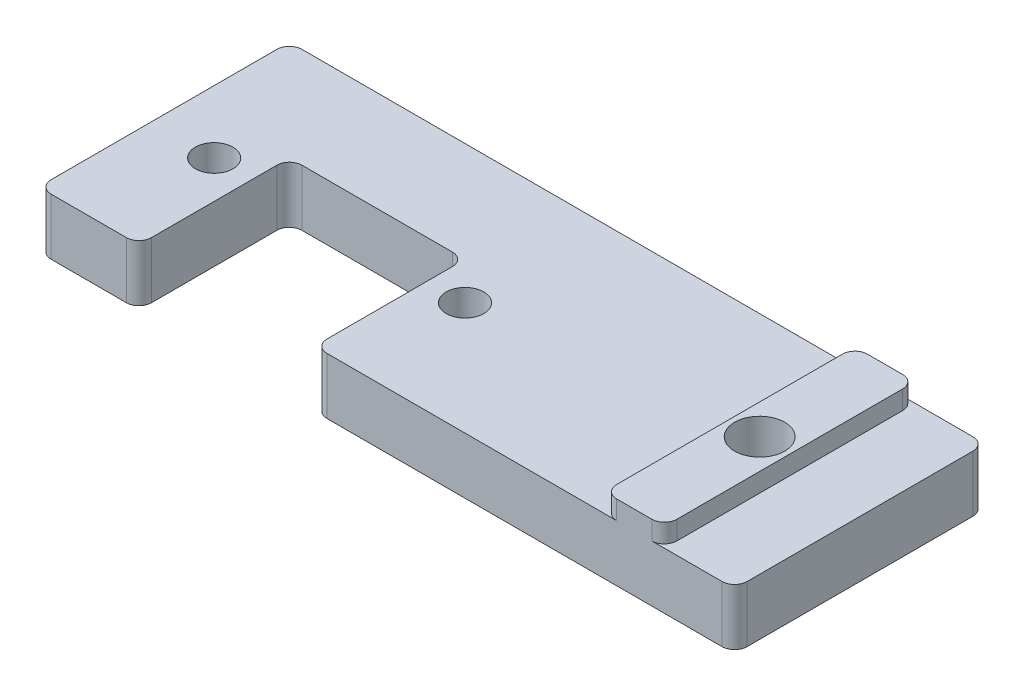
ISO-10303-21;
HEADER;
FILE_DESCRIPTION(('STEP AP214'),'2;1');
FILE_NAME('part.step','',(''),(''),'','','');
FILE_SCHEMA(('AUTOMOTIVE_DESIGN { 1 0 10303 214 1 1 1 1 }'));
ENDSEC;
DATA;
#1=APPLICATION_CONTEXT('core data for automotive mechanical design processes');
#2=APPLICATION_PROTOCOL_DEFINITION('international standard','automotive_design',2000,#1);
#3=PRODUCT_CONTEXT('',#1,'mechanical');
#4=PRODUCT('Part','Part','',(#3));
#5=PRODUCT_RELATED_PRODUCT_CATEGORY('part','',(#4));
#6=PRODUCT_DEFINITION_FORMATION('','',#4);
#7=PRODUCT_DEFINITION_CONTEXT('part definition',#1,'design');
#8=PRODUCT_DEFINITION('design','',#6,#7);
#9=PRODUCT_DEFINITION_SHAPE('','',#8);
#10=(LENGTH_UNIT() NAMED_UNIT(*) SI_UNIT(.MILLI.,.METRE.));
#11=(NAMED_UNIT(*) PLANE_ANGLE_UNIT() SI_UNIT($,.RADIAN.));
#12=(NAMED_UNIT(*) SI_UNIT($,.STERADIAN.) SOLID_ANGLE_UNIT());
#13=UNCERTAINTY_MEASURE_WITH_UNIT(LENGTH_MEASURE(1.E-05),#10,'distance_accuracy_value','');
#14=(GEOMETRIC_REPRESENTATION_CONTEXT(3) GLOBAL_UNCERTAINTY_ASSIGNED_CONTEXT((#13)) GLOBAL_UNIT_ASSIGNED_CONTEXT((#10,
#11,#12)) REPRESENTATION_CONTEXT('',''));
#15=CARTESIAN_POINT('',(0.,0.,0.));
#16=DIRECTION('',(0.,0.,1.));
#17=DIRECTION('',(1.,0.,0.));
#18=AXIS2_PLACEMENT_3D('',#15,#16,#17);
#19=CARTESIAN_POINT('',(0.,0.,0.));
#20=DIRECTION('',(0.,1.,0.));
#21=DIRECTION('',(0.,0.,1.));
#22=AXIS2_PLACEMENT_3D('',#19,#20,#21);
#23=PLANE('',#22);
#24=CARTESIAN_POINT('',(-10.,0.,0.));
#25=DIRECTION('',(0.,-1.,0.));
#26=DIRECTION('',(0.,0.,1.));
#27=AXIS2_PLACEMENT_3D('',#24,#25,#26);
#28=CIRCLE('',#27,1.5);
#29=CARTESIAN_POINT('',(-10.,0.,1.5));
#30=VERTEX_POINT('',#29);
#31=EDGE_CURVE('E337',#30,#30,#28,.T.);
#32=ORIENTED_EDGE('',*,*,#31,.F.);
#33=EDGE_LOOP('',(#32));
#34=FACE_BOUND('',#33,.T.);
#35=CARTESIAN_POINT('',(10.,0.,0.));
#36=DIRECTION('',(0.,1.,0.));
#37=DIRECTION('',(0.,0.,1.));
#38=AXIS2_PLACEMENT_3D('',#35,#36,#37);
#39=CIRCLE('',#38,1.5);
#40=CARTESIAN_POINT('',(10.,0.,1.5));
#41=VERTEX_POINT('',#40);
#42=EDGE_CURVE('E257',#41,#41,#39,.T.);
#43=ORIENTED_EDGE('',*,*,#42,.T.);
#44=EDGE_LOOP('',(#43));
#45=FACE_BOUND('',#44,.T.);
#46=DIRECTION('',(-1.,0.,0.));
#47=VECTOR('',#46,1.);
#48=CARTESIAN_POINT('',(15.,0.,-11.));
#49=LINE('',#48,#47);
#50=CARTESIAN_POINT('',(39.5,0.,-11.));
#51=VERTEX_POINT('',#50);
#52=CARTESIAN_POINT('',(-14.,0.,-11.));
#53=VERTEX_POINT('',#52);
#54=EDGE_CURVE('E196',#51,#53,#49,.T.);
#55=ORIENTED_EDGE('',*,*,#54,.F.);
#56=CARTESIAN_POINT('',(39.5,0.,-10.));
#57=DIRECTION('',(0.,1.,0.));
#58=DIRECTION('',(0.,0.,1.));
#59=AXIS2_PLACEMENT_3D('',#56,#57,#58);
#60=CIRCLE('',#59,1.);
#61=CARTESIAN_POINT('',(40.5,0.,-10.));
#62=VERTEX_POINT('',#61);
#63=EDGE_CURVE('E498',#51,#62,#60,.F.);
#64=ORIENTED_EDGE('',*,*,#63,.T.);
#65=DIRECTION('',(0.,0.,1.));
#66=VECTOR('',#65,1.);
#67=CARTESIAN_POINT('',(40.5,0.,-11.));
#68=LINE('',#67,#66);
#69=CARTESIAN_POINT('',(40.5,0.,8.));
#70=VERTEX_POINT('',#69);
#71=EDGE_CURVE('E334',#62,#70,#68,.T.);
#72=ORIENTED_EDGE('',*,*,#71,.T.);
#73=CARTESIAN_POINT('',(39.5,0.,8.));
#74=DIRECTION('',(0.,1.,0.));
#75=DIRECTION('',(0.,0.,1.));
#76=AXIS2_PLACEMENT_3D('',#73,#74,#75);
#77=CIRCLE('',#76,1.);
#78=CARTESIAN_POINT('',(39.5,0.,9.));
#79=VERTEX_POINT('',#78);
#80=EDGE_CURVE('E502',#70,#79,#77,.F.);
#81=ORIENTED_EDGE('',*,*,#80,.T.);
#82=DIRECTION('',(1.,0.,0.));
#83=VECTOR('',#82,1.);
#84=CARTESIAN_POINT('',(7.,0.,9.));
#85=LINE('',#84,#83);
#86=CARTESIAN_POINT('',(8.,0.,9.));
#87=VERTEX_POINT('',#86);
#88=EDGE_CURVE('E207',#87,#79,#85,.T.);
#89=ORIENTED_EDGE('',*,*,#88,.F.);
#90=CARTESIAN_POINT('',(8.,0.,8.));
#91=DIRECTION('',(0.,1.,0.));
#92=DIRECTION('',(0.,0.,1.));
#93=AXIS2_PLACEMENT_3D('',#90,#91,#92);
#94=CIRCLE('',#93,1.);
#95=CARTESIAN_POINT('',(7.,0.,8.));
#96=VERTEX_POINT('',#95);
#97=EDGE_CURVE('E296',#87,#96,#94,.F.);
#98=ORIENTED_EDGE('',*,*,#97,.T.);
#99=DIRECTION('',(0.,0.,1.));
#100=VECTOR('',#99,1.);
#101=CARTESIAN_POINT('',(7.,0.,9.));
#102=LINE('',#101,#100);
#103=CARTESIAN_POINT('',(7.,0.,-2.));
#104=VERTEX_POINT('',#103);
#105=EDGE_CURVE('E261',#104,#96,#102,.T.);
#106=ORIENTED_EDGE('',*,*,#105,.F.);
#107=CARTESIAN_POINT('',(6.,0.,-2.));
#108=DIRECTION('',(0.,1.,0.));
#109=DIRECTION('',(0.,0.,1.));
#110=AXIS2_PLACEMENT_3D('',#107,#108,#109);
#111=CIRCLE('',#110,1.);
#112=CARTESIAN_POINT('',(6.,0.,-3.));
#113=VERTEX_POINT('',#112);
#114=EDGE_CURVE('E282',#104,#113,#111,.T.);
#115=ORIENTED_EDGE('',*,*,#114,.T.);
#116=DIRECTION('',(1.,0.,0.));
#117=VECTOR('',#116,1.);
#118=CARTESIAN_POINT('',(7.,0.,-3.));
#119=LINE('',#118,#117);
#120=CARTESIAN_POINT('',(-6.,0.,-3.));
#121=VERTEX_POINT('',#120);
#122=EDGE_CURVE('E206',#121,#113,#119,.T.);
#123=ORIENTED_EDGE('',*,*,#122,.F.);
#124=CARTESIAN_POINT('',(-6.,0.,-2.));
#125=DIRECTION('',(0.,-1.,0.));
#126=DIRECTION('',(0.,0.,1.));
#127=AXIS2_PLACEMENT_3D('',#124,#125,#126);
#128=CIRCLE('',#127,1.);
#129=CARTESIAN_POINT('',(-7.,0.,-2.));
#130=VERTEX_POINT('',#129);
#131=EDGE_CURVE('E251',#130,#121,#128,.T.);
#132=ORIENTED_EDGE('',*,*,#131,.F.);
#133=DIRECTION('',(0.,0.,1.));
#134=VECTOR('',#133,1.);
#135=CARTESIAN_POINT('',(-7.,0.,9.));
#136=LINE('',#135,#134);
#137=CARTESIAN_POINT('',(-7.,0.,8.));
#138=VERTEX_POINT('',#137);
#139=EDGE_CURVE('E344',#130,#138,#136,.T.);
#140=ORIENTED_EDGE('',*,*,#139,.T.);
#141=CARTESIAN_POINT('',(-8.,0.,8.));
#142=DIRECTION('',(0.,-1.,0.));
#143=DIRECTION('',(0.,0.,1.));
#144=AXIS2_PLACEMENT_3D('',#141,#142,#143);
#145=CIRCLE('',#144,1.);
#146=CARTESIAN_POINT('',(-8.,0.,9.));
#147=VERTEX_POINT('',#146);
#148=EDGE_CURVE('E216',#147,#138,#145,.F.);
#149=ORIENTED_EDGE('',*,*,#148,.F.);
#150=DIRECTION('',(-1.,0.,0.));
#151=VECTOR('',#150,1.);
#152=CARTESIAN_POINT('',(-7.,0.,9.));
#153=LINE('',#152,#151);
#154=CARTESIAN_POINT('',(-14.,0.,9.));
#155=VERTEX_POINT('',#154);
#156=EDGE_CURVE('E357',#147,#155,#153,.T.);
#157=ORIENTED_EDGE('',*,*,#156,.T.);
#158=CARTESIAN_POINT('',(-14.,0.,8.));
#159=DIRECTION('',(0.,-1.,0.));
#160=DIRECTION('',(0.,0.,1.));
#161=AXIS2_PLACEMENT_3D('',#158,#159,#160);
#162=CIRCLE('',#161,1.);
#163=CARTESIAN_POINT('',(-15.,0.,8.));
#164=VERTEX_POINT('',#163);
#165=EDGE_CURVE('E224',#164,#155,#162,.F.);
#166=ORIENTED_EDGE('',*,*,#165,.F.);
#167=DIRECTION('',(0.,0.,-1.));
#168=VECTOR('',#167,1.);
#169=CARTESIAN_POINT('',(-15.,0.,9.));
#170=LINE('',#169,#168);
#171=CARTESIAN_POINT('',(-15.,0.,-10.));
#172=VERTEX_POINT('',#171);
#173=EDGE_CURVE('E222',#164,#172,#170,.T.);
#174=ORIENTED_EDGE('',*,*,#173,.T.);
#175=CARTESIAN_POINT('',(-14.,0.,-10.));
#176=DIRECTION('',(0.,-1.,0.));
#177=DIRECTION('',(0.,0.,1.));
#178=AXIS2_PLACEMENT_3D('',#175,#176,#177);
#179=CIRCLE('',#178,1.);
#180=EDGE_CURVE('E212',#53,#172,#179,.F.);
#181=ORIENTED_EDGE('',*,*,#180,.F.);
#182=EDGE_LOOP('',(#55,#64,#72,#81,#89,#98,#106,#115,#123,#132,#140,#149,#157,#166,#174,#181));
#183=FACE_BOUND('',#182,.T.);
#184=CARTESIAN_POINT('',(32.5,0.,-1.));
#185=DIRECTION('',(0.,-1.,0.));
#186=DIRECTION('',(0.,0.,-1.));
#187=AXIS2_PLACEMENT_3D('',#184,#185,#186);
#188=CIRCLE('',#187,2.);
#189=CARTESIAN_POINT('',(32.5,0.,-3.));
#190=VERTEX_POINT('',#189);
#191=EDGE_CURVE('E444',#190,#190,#188,.T.);
#192=ORIENTED_EDGE('',*,*,#191,.F.);
#193=EDGE_LOOP('',(#192));
#194=FACE_BOUND('',#193,.T.);
#195=ADVANCED_FACE('F33',(#34,#45,#183,#194),#23,.F.);
#196=CARTESIAN_POINT('',(0.,4.5,0.));
#197=DIRECTION('',(0.,1.,0.));
#198=DIRECTION('',(0.,0.,1.));
#199=AXIS2_PLACEMENT_3D('',#196,#197,#198);
#200=PLANE('',#199);
#201=CARTESIAN_POINT('',(-10.,4.5,0.));
#202=DIRECTION('',(0.,-1.,0.));
#203=DIRECTION('',(0.,0.,1.));
#204=AXIS2_PLACEMENT_3D('',#201,#202,#203);
#205=CIRCLE('',#204,1.5);
#206=CARTESIAN_POINT('',(-10.,4.5,1.5));
#207=VERTEX_POINT('',#206);
#208=EDGE_CURVE('E341',#207,#207,#205,.T.);
#209=ORIENTED_EDGE('',*,*,#208,.T.);
#210=EDGE_LOOP('',(#209));
#211=FACE_BOUND('',#210,.T.);
#212=CARTESIAN_POINT('',(10.,4.5,0.));
#213=DIRECTION('',(0.,1.,0.));
#214=DIRECTION('',(0.,0.,1.));
#215=AXIS2_PLACEMENT_3D('',#212,#213,#214);
#216=CIRCLE('',#215,1.5);
#217=CARTESIAN_POINT('',(10.,4.5,1.5));
#218=VERTEX_POINT('',#217);
#219=EDGE_CURVE('E258',#218,#218,#216,.T.);
#220=ORIENTED_EDGE('',*,*,#219,.F.);
#221=EDGE_LOOP('',(#220));
#222=FACE_BOUND('',#221,.T.);
#223=DIRECTION('',(1.,0.,0.));
#224=VECTOR('',#223,1.);
#225=CARTESIAN_POINT('',(7.,4.5,9.));
#226=LINE('',#225,#224);
#227=CARTESIAN_POINT('',(8.,4.5,9.));
#228=VERTEX_POINT('',#227);
#229=CARTESIAN_POINT('',(31.1,4.5,9.));
#230=VERTEX_POINT('',#229);
#231=EDGE_CURVE('E276',#228,#230,#226,.T.);
#232=ORIENTED_EDGE('',*,*,#231,.T.);
#233=CARTESIAN_POINT('',(31.1,4.5,8.));
#234=DIRECTION('',(0.,1.,0.));
#235=DIRECTION('',(0.,0.,1.));
#236=AXIS2_PLACEMENT_3D('',#233,#234,#235);
#237=CIRCLE('',#236,1.);
#238=CARTESIAN_POINT('',(30.1,4.5,8.));
#239=VERTEX_POINT('',#238);
#240=EDGE_CURVE('E501',#230,#239,#237,.F.);
#241=ORIENTED_EDGE('',*,*,#240,.T.);
#242=DIRECTION('',(0.,0.,-1.));
#243=VECTOR('',#242,1.);
#244=CARTESIAN_POINT('',(30.1,4.5,9.));
#245=LINE('',#244,#243);
#246=CARTESIAN_POINT('',(30.1,4.5,-10.));
#247=VERTEX_POINT('',#246);
#248=EDGE_CURVE('E327',#239,#247,#245,.T.);
#249=ORIENTED_EDGE('',*,*,#248,.T.);
#250=CARTESIAN_POINT('',(31.1,4.5,-10.));
#251=DIRECTION('',(0.,1.,0.));
#252=DIRECTION('',(0.,0.,1.));
#253=AXIS2_PLACEMENT_3D('',#250,#251,#252);
#254=CIRCLE('',#253,1.);
#255=CARTESIAN_POINT('',(31.1,4.5,-11.));
#256=VERTEX_POINT('',#255);
#257=EDGE_CURVE('E383',#247,#256,#254,.F.);
#258=ORIENTED_EDGE('',*,*,#257,.T.);
#259=DIRECTION('',(-1.,0.,0.));
#260=VECTOR('',#259,1.);
#261=CARTESIAN_POINT('',(15.,4.5,-11.));
#262=LINE('',#261,#260);
#263=CARTESIAN_POINT('',(-14.,4.5,-11.));
#264=VERTEX_POINT('',#263);
#265=EDGE_CURVE('E278',#256,#264,#262,.T.);
#266=ORIENTED_EDGE('',*,*,#265,.T.);
#267=CARTESIAN_POINT('',(-14.,4.5,-10.));
#268=DIRECTION('',(0.,-1.,0.));
#269=DIRECTION('',(0.,0.,1.));
#270=AXIS2_PLACEMENT_3D('',#267,#268,#269);
#271=CIRCLE('',#270,1.);
#272=CARTESIAN_POINT('',(-15.,4.5,-10.));
#273=VERTEX_POINT('',#272);
#274=EDGE_CURVE('E215',#273,#264,#271,.T.);
#275=ORIENTED_EDGE('',*,*,#274,.F.);
#276=DIRECTION('',(0.,0.,-1.));
#277=VECTOR('',#276,1.);
#278=CARTESIAN_POINT('',(-15.,4.5,9.));
#279=LINE('',#278,#277);
#280=CARTESIAN_POINT('',(-15.,4.5,8.));
#281=VERTEX_POINT('',#280);
#282=EDGE_CURVE('E217',#281,#273,#279,.T.);
#283=ORIENTED_EDGE('',*,*,#282,.F.);
#284=CARTESIAN_POINT('',(-14.,4.5,8.));
#285=DIRECTION('',(0.,-1.,0.));
#286=DIRECTION('',(0.,0.,1.));
#287=AXIS2_PLACEMENT_3D('',#284,#285,#286);
#288=CIRCLE('',#287,1.);
#289=CARTESIAN_POINT('',(-14.,4.5,9.));
#290=VERTEX_POINT('',#289);
#291=EDGE_CURVE('E236',#290,#281,#288,.T.);
#292=ORIENTED_EDGE('',*,*,#291,.F.);
#293=DIRECTION('',(-1.,0.,0.));
#294=VECTOR('',#293,1.);
#295=CARTESIAN_POINT('',(-7.,4.5,9.));
#296=LINE('',#295,#294);
#297=CARTESIAN_POINT('',(-8.,4.5,9.));
#298=VERTEX_POINT('',#297);
#299=EDGE_CURVE('E350',#298,#290,#296,.T.);
#300=ORIENTED_EDGE('',*,*,#299,.F.);
#301=CARTESIAN_POINT('',(-8.,4.5,8.));
#302=DIRECTION('',(0.,-1.,0.));
#303=DIRECTION('',(0.,0.,1.));
#304=AXIS2_PLACEMENT_3D('',#301,#302,#303);
#305=CIRCLE('',#304,1.);
#306=CARTESIAN_POINT('',(-7.,4.5,8.));
#307=VERTEX_POINT('',#306);
#308=EDGE_CURVE('E233',#307,#298,#305,.T.);
#309=ORIENTED_EDGE('',*,*,#308,.F.);
#310=DIRECTION('',(0.,0.,1.));
#311=VECTOR('',#310,1.);
#312=CARTESIAN_POINT('',(-7.,4.5,9.));
#313=LINE('',#312,#311);
#314=CARTESIAN_POINT('',(-7.,4.5,-2.));
#315=VERTEX_POINT('',#314);
#316=EDGE_CURVE('E347',#315,#307,#313,.T.);
#317=ORIENTED_EDGE('',*,*,#316,.F.);
#318=CARTESIAN_POINT('',(-6.,4.5,-2.));
#319=DIRECTION('',(0.,-1.,0.));
#320=DIRECTION('',(0.,0.,1.));
#321=AXIS2_PLACEMENT_3D('',#318,#319,#320);
#322=CIRCLE('',#321,1.);
#323=CARTESIAN_POINT('',(-6.,4.5,-3.));
#324=VERTEX_POINT('',#323);
#325=EDGE_CURVE('E254',#324,#315,#322,.F.);
#326=ORIENTED_EDGE('',*,*,#325,.F.);
#327=DIRECTION('',(1.,0.,0.));
#328=VECTOR('',#327,1.);
#329=CARTESIAN_POINT('',(7.,4.5,-3.));
#330=LINE('',#329,#328);
#331=CARTESIAN_POINT('',(6.,4.5,-3.));
#332=VERTEX_POINT('',#331);
#333=EDGE_CURVE('E298',#324,#332,#330,.T.);
#334=ORIENTED_EDGE('',*,*,#333,.T.);
#335=CARTESIAN_POINT('',(6.,4.5,-2.));
#336=DIRECTION('',(0.,1.,0.));
#337=DIRECTION('',(0.,0.,1.));
#338=AXIS2_PLACEMENT_3D('',#335,#336,#337);
#339=CIRCLE('',#338,1.);
#340=CARTESIAN_POINT('',(7.,4.5,-2.));
#341=VERTEX_POINT('',#340);
#342=EDGE_CURVE('E279',#332,#341,#339,.F.);
#343=ORIENTED_EDGE('',*,*,#342,.T.);
#344=DIRECTION('',(0.,0.,1.));
#345=VECTOR('',#344,1.);
#346=CARTESIAN_POINT('',(7.,4.5,9.));
#347=LINE('',#346,#345);
#348=CARTESIAN_POINT('',(7.,4.5,8.));
#349=VERTEX_POINT('',#348);
#350=EDGE_CURVE('E264',#341,#349,#347,.T.);
#351=ORIENTED_EDGE('',*,*,#350,.T.);
#352=CARTESIAN_POINT('',(8.,4.5,8.));
#353=DIRECTION('',(0.,1.,0.));
#354=DIRECTION('',(0.,0.,1.));
#355=AXIS2_PLACEMENT_3D('',#352,#353,#354);
#356=CIRCLE('',#355,1.);
#357=EDGE_CURVE('E294',#349,#228,#356,.T.);
#358=ORIENTED_EDGE('',*,*,#357,.T.);
#359=EDGE_LOOP('',(#232,#241,#249,#258,#266,#275,#283,#292,#300,#309,#317,#326,#334,#343,#351,#358));
#360=FACE_BOUND('',#359,.T.);
#361=ADVANCED_FACE('F372',(#211,#222,#360),#200,.T.);
#362=DIRECTION('',(0.,0.,-1.));
#363=VECTOR('',#362,1.);
#364=CARTESIAN_POINT('',(40.5,4.5,-11.));
#365=LINE('',#364,#363);
#366=CARTESIAN_POINT('',(40.5,4.5,8.));
#367=VERTEX_POINT('',#366);
#368=CARTESIAN_POINT('',(40.5,4.5,-10.));
#369=VERTEX_POINT('',#368);
#370=EDGE_CURVE('E338',#367,#369,#365,.T.);
#371=ORIENTED_EDGE('',*,*,#370,.T.);
#372=CARTESIAN_POINT('',(39.5,4.5,-10.));
#373=DIRECTION('',(0.,1.,0.));
#374=DIRECTION('',(0.,0.,1.));
#375=AXIS2_PLACEMENT_3D('',#372,#373,#374);
#376=CIRCLE('',#375,1.);
#377=CARTESIAN_POINT('',(39.5,4.5,-11.));
#378=VERTEX_POINT('',#377);
#379=EDGE_CURVE('E48',#369,#378,#376,.T.);
#380=ORIENTED_EDGE('',*,*,#379,.T.);
#381=CARTESIAN_POINT('',(33.9,4.5,-11.));
#382=VERTEX_POINT('',#381);
#383=EDGE_CURVE('E305',#378,#382,#262,.T.);
#384=ORIENTED_EDGE('',*,*,#383,.T.);
#385=CARTESIAN_POINT('',(33.9,4.5,-10.));
#386=DIRECTION('',(0.,1.,0.));
#387=DIRECTION('',(0.,0.,1.));
#388=AXIS2_PLACEMENT_3D('',#385,#386,#387);
#389=CIRCLE('',#388,1.);
#390=CARTESIAN_POINT('',(34.9,4.5,-10.));
#391=VERTEX_POINT('',#390);
#392=EDGE_CURVE('E41',#382,#391,#389,.F.);
#393=ORIENTED_EDGE('',*,*,#392,.T.);
#394=DIRECTION('',(0.,0.,1.));
#395=VECTOR('',#394,1.);
#396=CARTESIAN_POINT('',(34.9,4.5,9.));
#397=LINE('',#396,#395);
#398=CARTESIAN_POINT('',(34.9,4.5,8.));
#399=VERTEX_POINT('',#398);
#400=EDGE_CURVE('E322',#391,#399,#397,.T.);
#401=ORIENTED_EDGE('',*,*,#400,.T.);
#402=CARTESIAN_POINT('',(33.9,4.5,8.));
#403=DIRECTION('',(0.,1.,0.));
#404=DIRECTION('',(0.,0.,1.));
#405=AXIS2_PLACEMENT_3D('',#402,#403,#404);
#406=CIRCLE('',#405,1.);
#407=CARTESIAN_POINT('',(33.9,4.5,9.));
#408=VERTEX_POINT('',#407);
#409=EDGE_CURVE('E11',#399,#408,#406,.F.);
#410=ORIENTED_EDGE('',*,*,#409,.T.);
#411=CARTESIAN_POINT('',(39.5,4.5,9.));
#412=VERTEX_POINT('',#411);
#413=EDGE_CURVE('E267',#408,#412,#226,.T.);
#414=ORIENTED_EDGE('',*,*,#413,.T.);
#415=CARTESIAN_POINT('',(39.5,4.5,8.));
#416=DIRECTION('',(0.,1.,0.));
#417=DIRECTION('',(0.,0.,1.));
#418=AXIS2_PLACEMENT_3D('',#415,#416,#417);
#419=CIRCLE('',#418,1.);
#420=EDGE_CURVE('E56',#412,#367,#419,.T.);
#421=ORIENTED_EDGE('',*,*,#420,.T.);
#422=EDGE_LOOP('',(#371,#380,#384,#393,#401,#410,#414,#421));
#423=FACE_BOUND('',#422,.T.);
#424=ADVANCED_FACE('F427',(#423),#200,.T.);
#425=CARTESIAN_POINT('',(7.,4.5,9.));
#426=DIRECTION('',(1.,0.,0.));
#427=DIRECTION('',(0.,0.,-1.));
#428=AXIS2_PLACEMENT_3D('',#425,#426,#427);
#429=PLANE('',#428);
#430=ORIENTED_EDGE('',*,*,#105,.T.);
#431=DIRECTION('',(0.,-1.,0.));
#432=VECTOR('',#431,1.);
#433=CARTESIAN_POINT('',(7.,4.5,8.));
#434=LINE('',#433,#432);
#435=EDGE_CURVE('E286',#96,#349,#434,.F.);
#436=ORIENTED_EDGE('',*,*,#435,.T.);
#437=ORIENTED_EDGE('',*,*,#350,.F.);
#438=DIRECTION('',(0.,-1.,0.));
#439=VECTOR('',#438,1.);
#440=CARTESIAN_POINT('',(7.,0.,-2.));
#441=LINE('',#440,#439);
#442=EDGE_CURVE('E288',#341,#104,#441,.T.);
#443=ORIENTED_EDGE('',*,*,#442,.T.);
#444=EDGE_LOOP('',(#430,#436,#437,#443));
#445=FACE_BOUND('',#444,.T.);
#446=ADVANCED_FACE('F470',(#445),#429,.F.);
#447=CARTESIAN_POINT('',(7.,4.5,9.));
#448=DIRECTION('',(0.,0.,-1.));
#449=DIRECTION('',(-1.,0.,0.));
#450=AXIS2_PLACEMENT_3D('',#447,#448,#449);
#451=PLANE('',#450);
#452=DIRECTION('',(-1.,0.,0.));
#453=VECTOR('',#452,1.);
#454=CARTESIAN_POINT('',(30.1,6.,9.));
#455=LINE('',#454,#453);
#456=CARTESIAN_POINT('',(33.9,6.,9.));
#457=VERTEX_POINT('',#456);
#458=CARTESIAN_POINT('',(31.1,6.,9.));
#459=VERTEX_POINT('',#458);
#460=EDGE_CURVE('E340',#457,#459,#455,.T.);
#461=ORIENTED_EDGE('',*,*,#460,.T.);
#462=DIRECTION('',(0.,-1.,0.));
#463=VECTOR('',#462,1.);
#464=CARTESIAN_POINT('',(31.1,4.5,9.));
#465=LINE('',#464,#463);
#466=EDGE_CURVE('E412',#459,#230,#465,.T.);
#467=ORIENTED_EDGE('',*,*,#466,.T.);
#468=ORIENTED_EDGE('',*,*,#231,.F.);
#469=DIRECTION('',(0.,-1.,0.));
#470=VECTOR('',#469,1.);
#471=CARTESIAN_POINT('',(8.,4.5,9.));
#472=LINE('',#471,#470);
#473=EDGE_CURVE('E291',#228,#87,#472,.T.);
#474=ORIENTED_EDGE('',*,*,#473,.T.);
#475=ORIENTED_EDGE('',*,*,#88,.T.);
#476=DIRECTION('',(0.,1.,0.));
#477=VECTOR('',#476,1.);
#478=CARTESIAN_POINT('',(39.5,4.5,9.));
#479=LINE('',#478,#477);
#480=EDGE_CURVE('E281',#79,#412,#479,.T.);
#481=ORIENTED_EDGE('',*,*,#480,.T.);
#482=ORIENTED_EDGE('',*,*,#413,.F.);
#483=DIRECTION('',(0.,-1.,0.));
#484=VECTOR('',#483,1.);
#485=CARTESIAN_POINT('',(33.9,6.,9.));
#486=LINE('',#485,#484);
#487=EDGE_CURVE('E417',#408,#457,#486,.F.);
#488=ORIENTED_EDGE('',*,*,#487,.T.);
#489=EDGE_LOOP('',(#461,#467,#468,#474,#475,#481,#482,#488));
#490=FACE_BOUND('',#489,.T.);
#491=ADVANCED_FACE('F423',(#490),#451,.F.);
#492=CARTESIAN_POINT('',(15.,4.5,-11.));
#493=DIRECTION('',(0.,0.,1.));
#494=DIRECTION('',(1.,0.,0.));
#495=AXIS2_PLACEMENT_3D('',#492,#493,#494);
#496=PLANE('',#495);
#497=ORIENTED_EDGE('',*,*,#265,.F.);
#498=DIRECTION('',(0.,-1.,0.));
#499=VECTOR('',#498,1.);
#500=CARTESIAN_POINT('',(31.1,6.,-11.));
#501=LINE('',#500,#499);
#502=CARTESIAN_POINT('',(31.1,6.,-11.));
#503=VERTEX_POINT('',#502);
#504=EDGE_CURVE('E319',#256,#503,#501,.F.);
#505=ORIENTED_EDGE('',*,*,#504,.T.);
#506=DIRECTION('',(1.,0.,0.));
#507=VECTOR('',#506,1.);
#508=CARTESIAN_POINT('',(30.1,6.,-11.));
#509=LINE('',#508,#507);
#510=CARTESIAN_POINT('',(33.9,6.,-11.));
#511=VERTEX_POINT('',#510);
#512=EDGE_CURVE('E387',#503,#511,#509,.T.);
#513=ORIENTED_EDGE('',*,*,#512,.T.);
#514=DIRECTION('',(0.,-1.,0.));
#515=VECTOR('',#514,1.);
#516=CARTESIAN_POINT('',(33.9,4.5,-11.));
#517=LINE('',#516,#515);
#518=EDGE_CURVE('E316',#511,#382,#517,.T.);
#519=ORIENTED_EDGE('',*,*,#518,.T.);
#520=ORIENTED_EDGE('',*,*,#383,.F.);
#521=DIRECTION('',(0.,1.,0.));
#522=VECTOR('',#521,1.);
#523=CARTESIAN_POINT('',(39.5,0.,-11.));
#524=LINE('',#523,#522);
#525=EDGE_CURVE('E202',#378,#51,#524,.F.);
#526=ORIENTED_EDGE('',*,*,#525,.T.);
#527=ORIENTED_EDGE('',*,*,#54,.T.);
#528=DIRECTION('',(0.,-1.,0.));
#529=VECTOR('',#528,1.);
#530=CARTESIAN_POINT('',(-14.,4.5,-11.));
#531=LINE('',#530,#529);
#532=EDGE_CURVE('E199',#264,#53,#531,.T.);
#533=ORIENTED_EDGE('',*,*,#532,.F.);
#534=EDGE_LOOP('',(#497,#505,#513,#519,#520,#526,#527,#533));
#535=FACE_BOUND('',#534,.T.);
#536=ADVANCED_FACE('F198',(#535),#496,.F.);
#537=CARTESIAN_POINT('',(7.,4.5,-3.));
#538=DIRECTION('',(0.,0.,-1.));
#539=DIRECTION('',(-1.,0.,0.));
#540=AXIS2_PLACEMENT_3D('',#537,#538,#539);
#541=PLANE('',#540);
#542=ORIENTED_EDGE('',*,*,#122,.T.);
#543=DIRECTION('',(0.,-1.,0.));
#544=VECTOR('',#543,1.);
#545=CARTESIAN_POINT('',(6.,4.5,-3.));
#546=LINE('',#545,#544);
#547=EDGE_CURVE('E284',#113,#332,#546,.F.);
#548=ORIENTED_EDGE('',*,*,#547,.T.);
#549=ORIENTED_EDGE('',*,*,#333,.F.);
#550=DIRECTION('',(0.,-1.,0.));
#551=VECTOR('',#550,1.);
#552=CARTESIAN_POINT('',(-6.,4.5,-3.));
#553=LINE('',#552,#551);
#554=EDGE_CURVE('E248',#121,#324,#553,.F.);
#555=ORIENTED_EDGE('',*,*,#554,.F.);
#556=EDGE_LOOP('',(#542,#548,#549,#555));
#557=FACE_BOUND('',#556,.T.);
#558=ADVANCED_FACE('F461',(#557),#541,.F.);
#559=CARTESIAN_POINT('',(10.,4.5,0.));
#560=DIRECTION('',(0.,-1.,0.));
#561=DIRECTION('',(0.,0.,-1.));
#562=AXIS2_PLACEMENT_3D('',#559,#560,#561);
#563=CYLINDRICAL_SURFACE('',#562,1.5);
#564=ORIENTED_EDGE('',*,*,#219,.T.);
#565=EDGE_LOOP('',(#564));
#566=FACE_BOUND('',#565,.T.);
#567=ORIENTED_EDGE('',*,*,#42,.F.);
#568=EDGE_LOOP('',(#567));
#569=FACE_BOUND('',#568,.T.);
#570=ADVANCED_FACE('F464',(#566,#569),#563,.F.);
#571=CARTESIAN_POINT('',(8.,4.5,8.));
#572=DIRECTION('',(0.,-1.,0.));
#573=DIRECTION('',(0.,0.,-1.));
#574=AXIS2_PLACEMENT_3D('',#571,#572,#573);
#575=CYLINDRICAL_SURFACE('',#574,1.);
#576=ORIENTED_EDGE('',*,*,#357,.F.);
#577=ORIENTED_EDGE('',*,*,#435,.F.);
#578=ORIENTED_EDGE('',*,*,#97,.F.);
#579=ORIENTED_EDGE('',*,*,#473,.F.);
#580=EDGE_LOOP('',(#576,#577,#578,#579));
#581=FACE_BOUND('',#580,.T.);
#582=ADVANCED_FACE('F474',(#581),#575,.T.);
#583=CARTESIAN_POINT('',(6.,4.5,-2.));
#584=DIRECTION('',(0.,1.,0.));
#585=DIRECTION('',(0.,0.,1.));
#586=AXIS2_PLACEMENT_3D('',#583,#584,#585);
#587=CYLINDRICAL_SURFACE('',#586,1.);
#588=ORIENTED_EDGE('',*,*,#342,.F.);
#589=ORIENTED_EDGE('',*,*,#547,.F.);
#590=ORIENTED_EDGE('',*,*,#114,.F.);
#591=ORIENTED_EDGE('',*,*,#442,.F.);
#592=EDGE_LOOP('',(#588,#589,#590,#591));
#593=FACE_BOUND('',#592,.T.);
#594=ADVANCED_FACE('F477',(#593),#587,.F.);
#595=CARTESIAN_POINT('',(-7.,4.5,9.));
#596=DIRECTION('',(-1.,0.,0.));
#597=DIRECTION('',(0.,0.,-1.));
#598=AXIS2_PLACEMENT_3D('',#595,#596,#597);
#599=PLANE('',#598);
#600=ORIENTED_EDGE('',*,*,#139,.F.);
#601=DIRECTION('',(0.,-1.,0.));
#602=VECTOR('',#601,1.);
#603=CARTESIAN_POINT('',(-7.,0.,-2.));
#604=LINE('',#603,#602);
#605=EDGE_CURVE('E244',#315,#130,#604,.T.);
#606=ORIENTED_EDGE('',*,*,#605,.F.);
#607=ORIENTED_EDGE('',*,*,#316,.T.);
#608=DIRECTION('',(0.,-1.,0.));
#609=VECTOR('',#608,1.);
#610=CARTESIAN_POINT('',(-7.,4.5,8.));
#611=LINE('',#610,#609);
#612=EDGE_CURVE('E246',#138,#307,#611,.F.);
#613=ORIENTED_EDGE('',*,*,#612,.F.);
#614=EDGE_LOOP('',(#600,#606,#607,#613));
#615=FACE_BOUND('',#614,.T.);
#616=ADVANCED_FACE('F368',(#615),#599,.F.);
#617=CARTESIAN_POINT('',(-7.,4.5,9.));
#618=DIRECTION('',(0.,0.,-1.));
#619=DIRECTION('',(1.,0.,0.));
#620=AXIS2_PLACEMENT_3D('',#617,#618,#619);
#621=PLANE('',#620);
#622=ORIENTED_EDGE('',*,*,#156,.F.);
#623=DIRECTION('',(0.,-1.,0.));
#624=VECTOR('',#623,1.);
#625=CARTESIAN_POINT('',(-8.,4.5,9.));
#626=LINE('',#625,#624);
#627=EDGE_CURVE('E240',#298,#147,#626,.T.);
#628=ORIENTED_EDGE('',*,*,#627,.F.);
#629=ORIENTED_EDGE('',*,*,#299,.T.);
#630=DIRECTION('',(0.,-1.,0.));
#631=VECTOR('',#630,1.);
#632=CARTESIAN_POINT('',(-14.,4.5,9.));
#633=LINE('',#632,#631);
#634=EDGE_CURVE('E242',#155,#290,#633,.F.);
#635=ORIENTED_EDGE('',*,*,#634,.F.);
#636=EDGE_LOOP('',(#622,#628,#629,#635));
#637=FACE_BOUND('',#636,.T.);
#638=ADVANCED_FACE('F376',(#637),#621,.F.);
#639=CARTESIAN_POINT('',(-15.,4.5,9.));
#640=DIRECTION('',(1.,0.,0.));
#641=DIRECTION('',(0.,0.,1.));
#642=AXIS2_PLACEMENT_3D('',#639,#640,#641);
#643=PLANE('',#642);
#644=ORIENTED_EDGE('',*,*,#173,.F.);
#645=DIRECTION('',(0.,-1.,0.));
#646=VECTOR('',#645,1.);
#647=CARTESIAN_POINT('',(-15.,4.5,8.));
#648=LINE('',#647,#646);
#649=EDGE_CURVE('E223',#281,#164,#648,.T.);
#650=ORIENTED_EDGE('',*,*,#649,.F.);
#651=ORIENTED_EDGE('',*,*,#282,.T.);
#652=DIRECTION('',(0.,-1.,0.));
#653=VECTOR('',#652,1.);
#654=CARTESIAN_POINT('',(-15.,4.5,-10.));
#655=LINE('',#654,#653);
#656=EDGE_CURVE('E226',#172,#273,#655,.F.);
#657=ORIENTED_EDGE('',*,*,#656,.F.);
#658=EDGE_LOOP('',(#644,#650,#651,#657));
#659=FACE_BOUND('',#658,.T.);
#660=ADVANCED_FACE('F380',(#659),#643,.F.);
#661=CARTESIAN_POINT('',(-10.,4.5,0.));
#662=DIRECTION('',(0.,-1.,0.));
#663=DIRECTION('',(0.,0.,-1.));
#664=AXIS2_PLACEMENT_3D('',#661,#662,#663);
#665=CYLINDRICAL_SURFACE('',#664,1.5);
#666=ORIENTED_EDGE('',*,*,#208,.F.);
#667=EDGE_LOOP('',(#666));
#668=FACE_BOUND('',#667,.T.);
#669=ORIENTED_EDGE('',*,*,#31,.T.);
#670=EDGE_LOOP('',(#669));
#671=FACE_BOUND('',#670,.T.);
#672=ADVANCED_FACE('F542',(#668,#671),#665,.F.);
#673=CARTESIAN_POINT('',(-14.,4.5,-10.));
#674=DIRECTION('',(0.,-1.,0.));
#675=DIRECTION('',(0.,0.,-1.));
#676=AXIS2_PLACEMENT_3D('',#673,#674,#675);
#677=CYLINDRICAL_SURFACE('',#676,1.);
#678=ORIENTED_EDGE('',*,*,#274,.T.);
#679=ORIENTED_EDGE('',*,*,#532,.T.);
#680=ORIENTED_EDGE('',*,*,#180,.T.);
#681=ORIENTED_EDGE('',*,*,#656,.T.);
#682=EDGE_LOOP('',(#678,#679,#680,#681));
#683=FACE_BOUND('',#682,.T.);
#684=ADVANCED_FACE('F211',(#683),#677,.T.);
#685=CARTESIAN_POINT('',(-14.,4.5,8.));
#686=DIRECTION('',(0.,-1.,0.));
#687=DIRECTION('',(0.,0.,-1.));
#688=AXIS2_PLACEMENT_3D('',#685,#686,#687);
#689=CYLINDRICAL_SURFACE('',#688,1.);
#690=ORIENTED_EDGE('',*,*,#291,.T.);
#691=ORIENTED_EDGE('',*,*,#649,.T.);
#692=ORIENTED_EDGE('',*,*,#165,.T.);
#693=ORIENTED_EDGE('',*,*,#634,.T.);
#694=EDGE_LOOP('',(#690,#691,#692,#693));
#695=FACE_BOUND('',#694,.T.);
#696=ADVANCED_FACE('F378',(#695),#689,.T.);
#697=CARTESIAN_POINT('',(-8.,4.5,8.));
#698=DIRECTION('',(0.,-1.,0.));
#699=DIRECTION('',(0.,0.,-1.));
#700=AXIS2_PLACEMENT_3D('',#697,#698,#699);
#701=CYLINDRICAL_SURFACE('',#700,1.);
#702=ORIENTED_EDGE('',*,*,#308,.T.);
#703=ORIENTED_EDGE('',*,*,#627,.T.);
#704=ORIENTED_EDGE('',*,*,#148,.T.);
#705=ORIENTED_EDGE('',*,*,#612,.T.);
#706=EDGE_LOOP('',(#702,#703,#704,#705));
#707=FACE_BOUND('',#706,.T.);
#708=ADVANCED_FACE('F363',(#707),#701,.T.);
#709=CARTESIAN_POINT('',(-6.,4.5,-2.));
#710=DIRECTION('',(0.,1.,0.));
#711=DIRECTION('',(0.,0.,1.));
#712=AXIS2_PLACEMENT_3D('',#709,#710,#711);
#713=CYLINDRICAL_SURFACE('',#712,1.);
#714=ORIENTED_EDGE('',*,*,#325,.T.);
#715=ORIENTED_EDGE('',*,*,#605,.T.);
#716=ORIENTED_EDGE('',*,*,#131,.T.);
#717=ORIENTED_EDGE('',*,*,#554,.T.);
#718=EDGE_LOOP('',(#714,#715,#716,#717));
#719=FACE_BOUND('',#718,.T.);
#720=ADVANCED_FACE('F538',(#719),#713,.F.);
#721=CARTESIAN_POINT('',(40.5,-33.2001506020681,-11.));
#722=DIRECTION('',(1.,0.,0.));
#723=DIRECTION('',(0.,0.,-1.));
#724=AXIS2_PLACEMENT_3D('',#721,#722,#723);
#725=PLANE('',#724);
#726=ORIENTED_EDGE('',*,*,#71,.F.);
#727=DIRECTION('',(0.,1.,0.));
#728=VECTOR('',#727,1.);
#729=CARTESIAN_POINT('',(40.5,4.5,-10.));
#730=LINE('',#729,#728);
#731=EDGE_CURVE('E499',#62,#369,#730,.T.);
#732=ORIENTED_EDGE('',*,*,#731,.T.);
#733=ORIENTED_EDGE('',*,*,#370,.F.);
#734=DIRECTION('',(0.,1.,0.));
#735=VECTOR('',#734,1.);
#736=CARTESIAN_POINT('',(40.5,0.,8.));
#737=LINE('',#736,#735);
#738=EDGE_CURVE('E512',#367,#70,#737,.F.);
#739=ORIENTED_EDGE('',*,*,#738,.T.);
#740=EDGE_LOOP('',(#726,#732,#733,#739));
#741=FACE_BOUND('',#740,.T.);
#742=ADVANCED_FACE('F518',(#741),#725,.T.);
#743=CARTESIAN_POINT('',(30.1,6.,9.));
#744=DIRECTION('',(-1.,0.,0.));
#745=DIRECTION('',(0.,0.,1.));
#746=AXIS2_PLACEMENT_3D('',#743,#744,#745);
#747=PLANE('',#746);
#748=ORIENTED_EDGE('',*,*,#248,.F.);
#749=DIRECTION('',(0.,-1.,0.));
#750=VECTOR('',#749,1.);
#751=CARTESIAN_POINT('',(30.1,6.,8.));
#752=LINE('',#751,#750);
#753=CARTESIAN_POINT('',(30.1,6.,8.));
#754=VERTEX_POINT('',#753);
#755=EDGE_CURVE('E409',#239,#754,#752,.F.);
#756=ORIENTED_EDGE('',*,*,#755,.T.);
#757=DIRECTION('',(0.,0.,-1.));
#758=VECTOR('',#757,1.);
#759=CARTESIAN_POINT('',(30.1,6.,9.));
#760=LINE('',#759,#758);
#761=CARTESIAN_POINT('',(30.1,6.,-10.));
#762=VERTEX_POINT('',#761);
#763=EDGE_CURVE('E326',#754,#762,#760,.T.);
#764=ORIENTED_EDGE('',*,*,#763,.T.);
#765=DIRECTION('',(0.,-1.,0.));
#766=VECTOR('',#765,1.);
#767=CARTESIAN_POINT('',(30.1,4.5,-10.));
#768=LINE('',#767,#766);
#769=EDGE_CURVE('E404',#762,#247,#768,.T.);
#770=ORIENTED_EDGE('',*,*,#769,.T.);
#771=EDGE_LOOP('',(#748,#756,#764,#770));
#772=FACE_BOUND('',#771,.T.);
#773=ADVANCED_FACE('F530',(#772),#747,.T.);
#774=CARTESIAN_POINT('',(34.9,6.,9.));
#775=DIRECTION('',(1.,0.,0.));
#776=DIRECTION('',(0.,0.,-1.));
#777=AXIS2_PLACEMENT_3D('',#774,#775,#776);
#778=PLANE('',#777);
#779=ORIENTED_EDGE('',*,*,#400,.F.);
#780=DIRECTION('',(0.,-1.,0.));
#781=VECTOR('',#780,1.);
#782=CARTESIAN_POINT('',(34.9,6.,-10.));
#783=LINE('',#782,#781);
#784=CARTESIAN_POINT('',(34.9,6.,-10.));
#785=VERTEX_POINT('',#784);
#786=EDGE_CURVE('E511',#391,#785,#783,.F.);
#787=ORIENTED_EDGE('',*,*,#786,.T.);
#788=DIRECTION('',(0.,0.,1.));
#789=VECTOR('',#788,1.);
#790=CARTESIAN_POINT('',(34.9,6.,9.));
#791=LINE('',#790,#789);
#792=CARTESIAN_POINT('',(34.9,6.,8.));
#793=VERTEX_POINT('',#792);
#794=EDGE_CURVE('E399',#785,#793,#791,.T.);
#795=ORIENTED_EDGE('',*,*,#794,.T.);
#796=DIRECTION('',(0.,-1.,0.));
#797=VECTOR('',#796,1.);
#798=CARTESIAN_POINT('',(34.9,4.5,8.));
#799=LINE('',#798,#797);
#800=EDGE_CURVE('E321',#793,#399,#799,.T.);
#801=ORIENTED_EDGE('',*,*,#800,.T.);
#802=EDGE_LOOP('',(#779,#787,#795,#801));
#803=FACE_BOUND('',#802,.T.);
#804=ADVANCED_FACE('F510',(#803),#778,.T.);
#805=CARTESIAN_POINT('',(0.,6.,0.));
#806=DIRECTION('',(0.,-1.,0.));
#807=DIRECTION('',(0.,0.,-1.));
#808=AXIS2_PLACEMENT_3D('',#805,#806,#807);
#809=PLANE('',#808);
#810=CARTESIAN_POINT('',(32.5,6.,-1.));
#811=DIRECTION('',(0.,-1.,0.));
#812=DIRECTION('',(0.,0.,-1.));
#813=AXIS2_PLACEMENT_3D('',#810,#811,#812);
#814=CIRCLE('',#813,2.);
#815=CARTESIAN_POINT('',(32.5,6.,-3.));
#816=VERTEX_POINT('',#815);
#817=EDGE_CURVE('E414',#816,#816,#814,.T.);
#818=ORIENTED_EDGE('',*,*,#817,.T.);
#819=EDGE_LOOP('',(#818));
#820=FACE_BOUND('',#819,.T.);
#821=ORIENTED_EDGE('',*,*,#763,.F.);
#822=CARTESIAN_POINT('',(31.1,6.,8.));
#823=DIRECTION('',(0.,-1.,0.));
#824=DIRECTION('',(0.,0.,-1.));
#825=AXIS2_PLACEMENT_3D('',#822,#823,#824);
#826=CIRCLE('',#825,1.);
#827=EDGE_CURVE('E313',#754,#459,#826,.F.);
#828=ORIENTED_EDGE('',*,*,#827,.T.);
#829=ORIENTED_EDGE('',*,*,#460,.F.);
#830=CARTESIAN_POINT('',(33.9,6.,8.));
#831=DIRECTION('',(0.,-1.,0.));
#832=DIRECTION('',(0.,0.,-1.));
#833=AXIS2_PLACEMENT_3D('',#830,#831,#832);
#834=CIRCLE('',#833,1.);
#835=EDGE_CURVE('E405',#457,#793,#834,.F.);
#836=ORIENTED_EDGE('',*,*,#835,.T.);
#837=ORIENTED_EDGE('',*,*,#794,.F.);
#838=CARTESIAN_POINT('',(33.9,6.,-10.));
#839=DIRECTION('',(0.,-1.,0.));
#840=DIRECTION('',(0.,0.,-1.));
#841=AXIS2_PLACEMENT_3D('',#838,#839,#840);
#842=CIRCLE('',#841,1.);
#843=EDGE_CURVE('E398',#785,#511,#842,.F.);
#844=ORIENTED_EDGE('',*,*,#843,.T.);
#845=ORIENTED_EDGE('',*,*,#512,.F.);
#846=CARTESIAN_POINT('',(31.1,6.,-10.));
#847=DIRECTION('',(0.,-1.,0.));
#848=DIRECTION('',(0.,0.,-1.));
#849=AXIS2_PLACEMENT_3D('',#846,#847,#848);
#850=CIRCLE('',#849,1.);
#851=EDGE_CURVE('E394',#503,#762,#850,.F.);
#852=ORIENTED_EDGE('',*,*,#851,.T.);
#853=EDGE_LOOP('',(#821,#828,#829,#836,#837,#844,#845,#852));
#854=FACE_BOUND('',#853,.T.);
#855=ADVANCED_FACE('F393',(#820,#854),#809,.F.);
#856=CARTESIAN_POINT('',(32.5,6.,-1.));
#857=DIRECTION('',(0.,-1.,0.));
#858=DIRECTION('',(0.,0.,-1.));
#859=AXIS2_PLACEMENT_3D('',#856,#857,#858);
#860=CYLINDRICAL_SURFACE('',#859,2.);
#861=ORIENTED_EDGE('',*,*,#817,.F.);
#862=EDGE_LOOP('',(#861));
#863=FACE_BOUND('',#862,.T.);
#864=ORIENTED_EDGE('',*,*,#191,.T.);
#865=EDGE_LOOP('',(#864));
#866=FACE_BOUND('',#865,.T.);
#867=ADVANCED_FACE('F448',(#863,#866),#860,.F.);
#868=CARTESIAN_POINT('',(31.1,4.5,8.));
#869=DIRECTION('',(0.,1.,0.));
#870=DIRECTION('',(0.,0.,1.));
#871=AXIS2_PLACEMENT_3D('',#868,#869,#870);
#872=CYLINDRICAL_SURFACE('',#871,1.);
#873=ORIENTED_EDGE('',*,*,#827,.F.);
#874=ORIENTED_EDGE('',*,*,#755,.F.);
#875=ORIENTED_EDGE('',*,*,#240,.F.);
#876=ORIENTED_EDGE('',*,*,#466,.F.);
#877=EDGE_LOOP('',(#873,#874,#875,#876));
#878=FACE_BOUND('',#877,.T.);
#879=ADVANCED_FACE('F482',(#878),#872,.T.);
#880=CARTESIAN_POINT('',(31.1,6.,-10.));
#881=DIRECTION('',(0.,1.,0.));
#882=DIRECTION('',(0.,0.,1.));
#883=AXIS2_PLACEMENT_3D('',#880,#881,#882);
#884=CYLINDRICAL_SURFACE('',#883,1.);
#885=ORIENTED_EDGE('',*,*,#851,.F.);
#886=ORIENTED_EDGE('',*,*,#504,.F.);
#887=ORIENTED_EDGE('',*,*,#257,.F.);
#888=ORIENTED_EDGE('',*,*,#769,.F.);
#889=EDGE_LOOP('',(#885,#886,#887,#888));
#890=FACE_BOUND('',#889,.T.);
#891=ADVANCED_FACE('F402',(#890),#884,.T.);
#892=CARTESIAN_POINT('',(33.9,4.5,-10.));
#893=DIRECTION('',(0.,1.,0.));
#894=DIRECTION('',(0.,0.,1.));
#895=AXIS2_PLACEMENT_3D('',#892,#893,#894);
#896=CYLINDRICAL_SURFACE('',#895,1.);
#897=ORIENTED_EDGE('',*,*,#843,.F.);
#898=ORIENTED_EDGE('',*,*,#786,.F.);
#899=ORIENTED_EDGE('',*,*,#392,.F.);
#900=ORIENTED_EDGE('',*,*,#518,.F.);
#901=EDGE_LOOP('',(#897,#898,#899,#900));
#902=FACE_BOUND('',#901,.T.);
#903=ADVANCED_FACE('F488',(#902),#896,.T.);
#904=CARTESIAN_POINT('',(33.9,6.,8.));
#905=DIRECTION('',(0.,1.,0.));
#906=DIRECTION('',(0.,0.,1.));
#907=AXIS2_PLACEMENT_3D('',#904,#905,#906);
#908=CYLINDRICAL_SURFACE('',#907,1.);
#909=ORIENTED_EDGE('',*,*,#835,.F.);
#910=ORIENTED_EDGE('',*,*,#487,.F.);
#911=ORIENTED_EDGE('',*,*,#409,.F.);
#912=ORIENTED_EDGE('',*,*,#800,.F.);
#913=EDGE_LOOP('',(#909,#910,#911,#912));
#914=FACE_BOUND('',#913,.T.);
#915=ADVANCED_FACE('F434',(#914),#908,.T.);
#916=CARTESIAN_POINT('',(39.5,-33.2001506020681,-10.));
#917=DIRECTION('',(0.,-1.,0.));
#918=DIRECTION('',(0.,0.,-1.));
#919=AXIS2_PLACEMENT_3D('',#916,#917,#918);
#920=CYLINDRICAL_SURFACE('',#919,1.);
#921=ORIENTED_EDGE('',*,*,#63,.F.);
#922=ORIENTED_EDGE('',*,*,#525,.F.);
#923=ORIENTED_EDGE('',*,*,#379,.F.);
#924=ORIENTED_EDGE('',*,*,#731,.F.);
#925=EDGE_LOOP('',(#921,#922,#923,#924));
#926=FACE_BOUND('',#925,.T.);
#927=ADVANCED_FACE('F493',(#926),#920,.T.);
#928=CARTESIAN_POINT('',(39.5,4.5,8.));
#929=DIRECTION('',(0.,-1.,0.));
#930=DIRECTION('',(0.,0.,-1.));
#931=AXIS2_PLACEMENT_3D('',#928,#929,#930);
#932=CYLINDRICAL_SURFACE('',#931,1.);
#933=ORIENTED_EDGE('',*,*,#80,.F.);
#934=ORIENTED_EDGE('',*,*,#738,.F.);
#935=ORIENTED_EDGE('',*,*,#420,.F.);
#936=ORIENTED_EDGE('',*,*,#480,.F.);
#937=EDGE_LOOP('',(#933,#934,#935,#936));
#938=FACE_BOUND('',#937,.T.);
#939=ADVANCED_FACE('F35',(#938),#932,.T.);
#940=CLOSED_SHELL('',(#195,#361,#424,#446,#491,#536,#558,#570,#582,#594,#616,#638,#660,#672,
#684,#696,#708,#720,#742,#773,#804,#855,#867,#879,#891,#903,#915,#927,#939));
#941=MANIFOLD_SOLID_BREP('B2',#940);
#942=ADVANCED_BREP_SHAPE_REPRESENTATION('',(#18,#941),#14);
#943=SHAPE_DEFINITION_REPRESENTATION(#9,#942);
ENDSEC;
END-ISO-10303-21;
